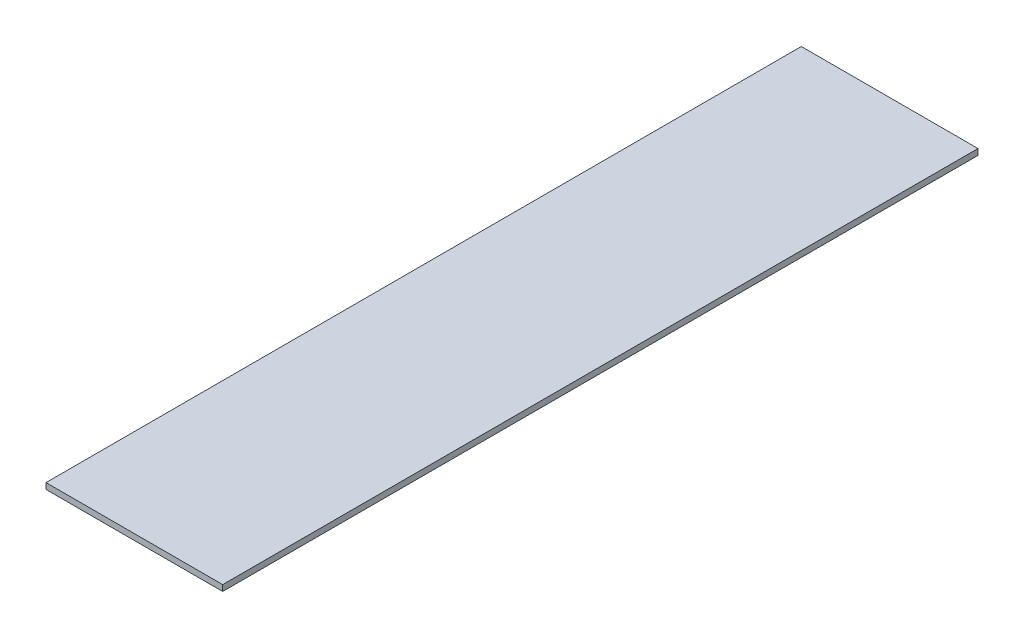
ISO-10303-21;
HEADER;
FILE_DESCRIPTION(('STEP AP214'),'2;1');
FILE_NAME('part.step','',(''),(''),'','','');
FILE_SCHEMA(('AUTOMOTIVE_DESIGN { 1 0 10303 214 1 1 1 1 }'));
ENDSEC;
DATA;
#1=APPLICATION_CONTEXT('core data for automotive mechanical design processes');
#2=APPLICATION_PROTOCOL_DEFINITION('international standard','automotive_design',2000,#1);
#3=PRODUCT_CONTEXT('',#1,'mechanical');
#4=PRODUCT('Part','Part','',(#3));
#5=PRODUCT_RELATED_PRODUCT_CATEGORY('part','',(#4));
#6=PRODUCT_DEFINITION_FORMATION('','',#4);
#7=PRODUCT_DEFINITION_CONTEXT('part definition',#1,'design');
#8=PRODUCT_DEFINITION('design','',#6,#7);
#9=PRODUCT_DEFINITION_SHAPE('','',#8);
#10=(LENGTH_UNIT() NAMED_UNIT(*) SI_UNIT(.MILLI.,.METRE.));
#11=(NAMED_UNIT(*) PLANE_ANGLE_UNIT() SI_UNIT($,.RADIAN.));
#12=(NAMED_UNIT(*) SI_UNIT($,.STERADIAN.) SOLID_ANGLE_UNIT());
#13=UNCERTAINTY_MEASURE_WITH_UNIT(LENGTH_MEASURE(1.E-05),#10,'distance_accuracy_value','');
#14=(GEOMETRIC_REPRESENTATION_CONTEXT(3) GLOBAL_UNCERTAINTY_ASSIGNED_CONTEXT((#13)) GLOBAL_UNIT_ASSIGNED_CONTEXT((#10,
#11,#12)) REPRESENTATION_CONTEXT('',''));
#15=CARTESIAN_POINT('',(0.,0.,0.));
#16=DIRECTION('',(0.,0.,1.));
#17=DIRECTION('',(1.,0.,0.));
#18=AXIS2_PLACEMENT_3D('',#15,#16,#17);
#19=CARTESIAN_POINT('',(-66.55,4.5,-284.5));
#20=DIRECTION('',(1.,0.,0.));
#21=DIRECTION('',(0.,0.,-1.));
#22=AXIS2_PLACEMENT_3D('',#19,#20,#21);
#23=PLANE('',#22);
#24=DIRECTION('',(0.,0.,1.));
#25=VECTOR('',#24,1.);
#26=CARTESIAN_POINT('',(-66.55,0.,-284.5));
#27=LINE('',#26,#25);
#28=CARTESIAN_POINT('',(-66.55,0.,-284.5));
#29=VERTEX_POINT('',#28);
#30=CARTESIAN_POINT('',(-66.55,0.,284.5));
#31=VERTEX_POINT('',#30);
#32=EDGE_CURVE('E107',#29,#31,#27,.T.);
#33=ORIENTED_EDGE('',*,*,#32,.T.);
#34=DIRECTION('',(0.,-1.,0.));
#35=VECTOR('',#34,1.);
#36=CARTESIAN_POINT('',(-66.55,4.5,284.5));
#37=LINE('',#36,#35);
#38=CARTESIAN_POINT('',(-66.55,4.5,284.5));
#39=VERTEX_POINT('',#38);
#40=EDGE_CURVE('E11',#39,#31,#37,.T.);
#41=ORIENTED_EDGE('',*,*,#40,.F.);
#42=DIRECTION('',(0.,0.,1.));
#43=VECTOR('',#42,1.);
#44=CARTESIAN_POINT('',(-66.55,4.5,-284.5));
#45=LINE('',#44,#43);
#46=CARTESIAN_POINT('',(-66.55,4.5,-284.5));
#47=VERTEX_POINT('',#46);
#48=EDGE_CURVE('E91',#47,#39,#45,.T.);
#49=ORIENTED_EDGE('',*,*,#48,.F.);
#50=DIRECTION('',(0.,-1.,0.));
#51=VECTOR('',#50,1.);
#52=CARTESIAN_POINT('',(-66.55,4.5,-284.5));
#53=LINE('',#52,#51);
#54=EDGE_CURVE('E103',#47,#29,#53,.T.);
#55=ORIENTED_EDGE('',*,*,#54,.T.);
#56=EDGE_LOOP('',(#33,#41,#49,#55));
#57=FACE_BOUND('',#56,.T.);
#58=ADVANCED_FACE('F39',(#57),#23,.F.);
#59=CARTESIAN_POINT('',(-66.55,4.5,284.5));
#60=DIRECTION('',(0.,0.,-1.));
#61=DIRECTION('',(-1.,0.,0.));
#62=AXIS2_PLACEMENT_3D('',#59,#60,#61);
#63=PLANE('',#62);
#64=DIRECTION('',(1.,0.,0.));
#65=VECTOR('',#64,1.);
#66=CARTESIAN_POINT('',(-66.55,0.,284.5));
#67=LINE('',#66,#65);
#68=CARTESIAN_POINT('',(66.5500000000001,0.,284.5));
#69=VERTEX_POINT('',#68);
#70=EDGE_CURVE('E96',#31,#69,#67,.T.);
#71=ORIENTED_EDGE('',*,*,#70,.T.);
#72=DIRECTION('',(0.,-1.,0.));
#73=VECTOR('',#72,1.);
#74=CARTESIAN_POINT('',(66.5500000000001,4.5,284.5));
#75=LINE('',#74,#73);
#76=CARTESIAN_POINT('',(66.5500000000001,4.5,284.5));
#77=VERTEX_POINT('',#76);
#78=EDGE_CURVE('E48',#77,#69,#75,.T.);
#79=ORIENTED_EDGE('',*,*,#78,.F.);
#80=DIRECTION('',(1.,0.,0.));
#81=VECTOR('',#80,1.);
#82=CARTESIAN_POINT('',(-66.55,4.5,284.5));
#83=LINE('',#82,#81);
#84=EDGE_CURVE('E86',#39,#77,#83,.T.);
#85=ORIENTED_EDGE('',*,*,#84,.F.);
#86=ORIENTED_EDGE('',*,*,#40,.T.);
#87=EDGE_LOOP('',(#71,#79,#85,#86));
#88=FACE_BOUND('',#87,.T.);
#89=ADVANCED_FACE('F95',(#88),#63,.F.);
#90=CARTESIAN_POINT('',(66.55,4.5,-284.5));
#91=DIRECTION('',(-1.,0.,0.));
#92=DIRECTION('',(0.,0.,1.));
#93=AXIS2_PLACEMENT_3D('',#90,#91,#92);
#94=PLANE('',#93);
#95=DIRECTION('',(0.,0.,-1.));
#96=VECTOR('',#95,1.);
#97=CARTESIAN_POINT('',(66.55,0.,-284.5));
#98=LINE('',#97,#96);
#99=CARTESIAN_POINT('',(66.55,0.,-284.5));
#100=VERTEX_POINT('',#99);
#101=EDGE_CURVE('E73',#69,#100,#98,.T.);
#102=ORIENTED_EDGE('',*,*,#101,.T.);
#103=DIRECTION('',(0.,-1.,0.));
#104=VECTOR('',#103,1.);
#105=CARTESIAN_POINT('',(66.55,4.5,-284.5));
#106=LINE('',#105,#104);
#107=CARTESIAN_POINT('',(66.55,4.5,-284.5));
#108=VERTEX_POINT('',#107);
#109=EDGE_CURVE('E98',#108,#100,#106,.T.);
#110=ORIENTED_EDGE('',*,*,#109,.F.);
#111=DIRECTION('',(0.,0.,-1.));
#112=VECTOR('',#111,1.);
#113=CARTESIAN_POINT('',(66.55,4.5,-284.5));
#114=LINE('',#113,#112);
#115=EDGE_CURVE('E89',#77,#108,#114,.T.);
#116=ORIENTED_EDGE('',*,*,#115,.F.);
#117=ORIENTED_EDGE('',*,*,#78,.T.);
#118=EDGE_LOOP('',(#102,#110,#116,#117));
#119=FACE_BOUND('',#118,.T.);
#120=ADVANCED_FACE('F99',(#119),#94,.F.);
#121=CARTESIAN_POINT('',(-66.55,4.5,-284.5));
#122=DIRECTION('',(0.,0.,1.));
#123=DIRECTION('',(1.,0.,0.));
#124=AXIS2_PLACEMENT_3D('',#121,#122,#123);
#125=PLANE('',#124);
#126=DIRECTION('',(-1.,0.,0.));
#127=VECTOR('',#126,1.);
#128=CARTESIAN_POINT('',(-66.55,0.,-284.5));
#129=LINE('',#128,#127);
#130=EDGE_CURVE('E79',#100,#29,#129,.T.);
#131=ORIENTED_EDGE('',*,*,#130,.T.);
#132=ORIENTED_EDGE('',*,*,#54,.F.);
#133=DIRECTION('',(-1.,0.,0.));
#134=VECTOR('',#133,1.);
#135=CARTESIAN_POINT('',(-66.55,4.5,-284.5));
#136=LINE('',#135,#134);
#137=EDGE_CURVE('E56',#108,#47,#136,.T.);
#138=ORIENTED_EDGE('',*,*,#137,.F.);
#139=ORIENTED_EDGE('',*,*,#109,.T.);
#140=EDGE_LOOP('',(#131,#132,#138,#139));
#141=FACE_BOUND('',#140,.T.);
#142=ADVANCED_FACE('F120',(#141),#125,.F.);
#143=CARTESIAN_POINT('',(0.,4.5,0.));
#144=DIRECTION('',(0.,1.,0.));
#145=DIRECTION('',(0.,0.,1.));
#146=AXIS2_PLACEMENT_3D('',#143,#144,#145);
#147=PLANE('',#146);
#148=ORIENTED_EDGE('',*,*,#48,.T.);
#149=ORIENTED_EDGE('',*,*,#84,.T.);
#150=ORIENTED_EDGE('',*,*,#115,.T.);
#151=ORIENTED_EDGE('',*,*,#137,.T.);
#152=EDGE_LOOP('',(#148,#149,#150,#151));
#153=FACE_BOUND('',#152,.T.);
#154=ADVANCED_FACE('F87',(#153),#147,.T.);
#155=CARTESIAN_POINT('',(0.,0.,0.));
#156=DIRECTION('',(0.,1.,0.));
#157=DIRECTION('',(0.,0.,1.));
#158=AXIS2_PLACEMENT_3D('',#155,#156,#157);
#159=PLANE('',#158);
#160=ORIENTED_EDGE('',*,*,#32,.F.);
#161=ORIENTED_EDGE('',*,*,#130,.F.);
#162=ORIENTED_EDGE('',*,*,#101,.F.);
#163=ORIENTED_EDGE('',*,*,#70,.F.);
#164=EDGE_LOOP('',(#160,#161,#162,#163));
#165=FACE_BOUND('',#164,.T.);
#166=ADVANCED_FACE('F123',(#165),#159,.F.);
#167=CLOSED_SHELL('',(#58,#89,#120,#142,#154,#166));
#168=MANIFOLD_SOLID_BREP('B2',#167);
#169=ADVANCED_BREP_SHAPE_REPRESENTATION('',(#18,#168),#14);
#170=SHAPE_DEFINITION_REPRESENTATION(#9,#169);
ENDSEC;
END-ISO-10303-21;
